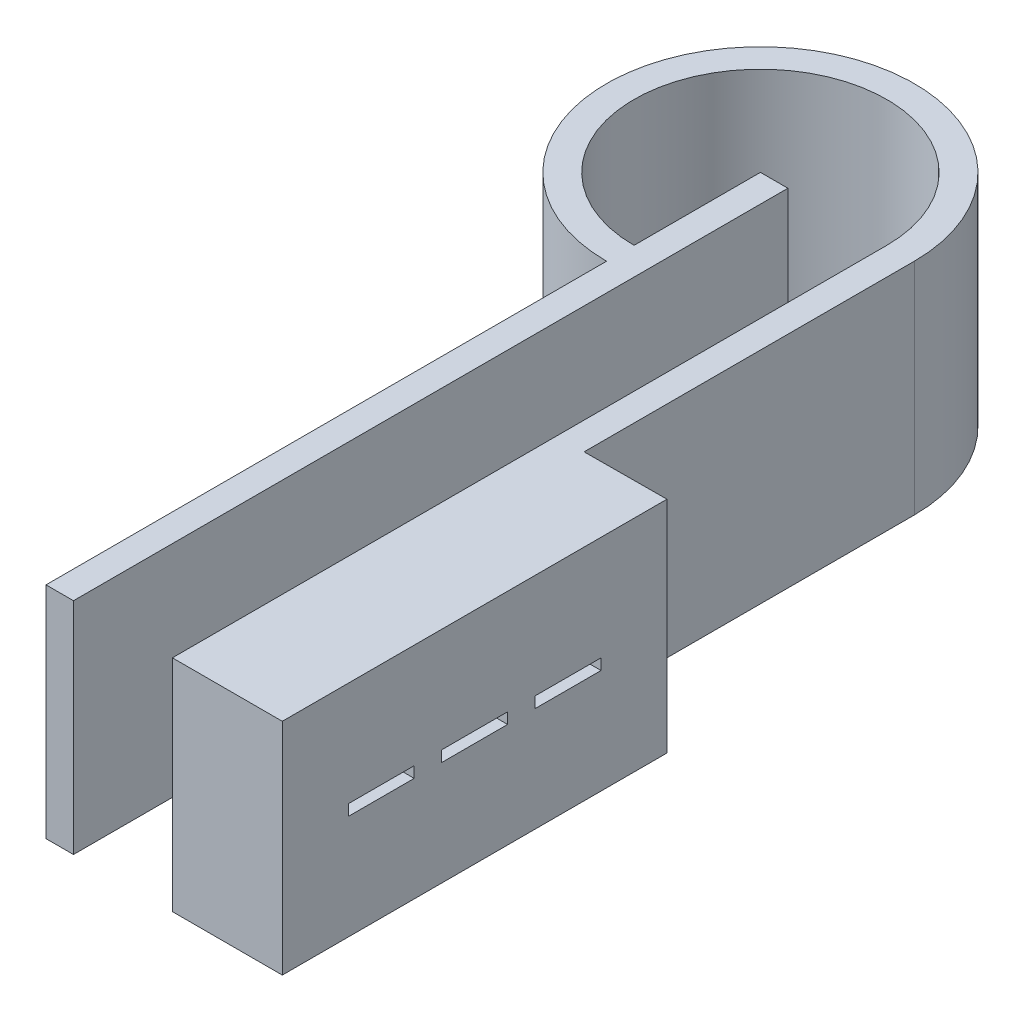
ISO-10303-21;
HEADER;
FILE_DESCRIPTION(('STEP AP214'),'2;1');
FILE_NAME('part.step','',(''),(''),'','','');
FILE_SCHEMA(('AUTOMOTIVE_DESIGN { 1 0 10303 214 1 1 1 1 }'));
ENDSEC;
DATA;
#1=APPLICATION_CONTEXT('core data for automotive mechanical design processes');
#2=APPLICATION_PROTOCOL_DEFINITION('international standard','automotive_design',2000,#1);
#3=PRODUCT_CONTEXT('',#1,'mechanical');
#4=PRODUCT('Part','Part','',(#3));
#5=PRODUCT_RELATED_PRODUCT_CATEGORY('part','',(#4));
#6=PRODUCT_DEFINITION_FORMATION('','',#4);
#7=PRODUCT_DEFINITION_CONTEXT('part definition',#1,'design');
#8=PRODUCT_DEFINITION('design','',#6,#7);
#9=PRODUCT_DEFINITION_SHAPE('','',#8);
#10=(LENGTH_UNIT() NAMED_UNIT(*) SI_UNIT(.MILLI.,.METRE.));
#11=(NAMED_UNIT(*) PLANE_ANGLE_UNIT() SI_UNIT($,.RADIAN.));
#12=(NAMED_UNIT(*) SI_UNIT($,.STERADIAN.) SOLID_ANGLE_UNIT());
#13=UNCERTAINTY_MEASURE_WITH_UNIT(LENGTH_MEASURE(1.E-05),#10,'distance_accuracy_value','');
#14=(GEOMETRIC_REPRESENTATION_CONTEXT(3) GLOBAL_UNCERTAINTY_ASSIGNED_CONTEXT((#13)) GLOBAL_UNIT_ASSIGNED_CONTEXT((#10,
#11,#12)) REPRESENTATION_CONTEXT('',''));
#15=CARTESIAN_POINT('',(0.,0.,0.));
#16=DIRECTION('',(0.,0.,1.));
#17=DIRECTION('',(1.,0.,0.));
#18=AXIS2_PLACEMENT_3D('',#15,#16,#17);
#19=CARTESIAN_POINT('',(-22.301242738674,20.,0.));
#20=DIRECTION('',(1.,0.,0.));
#21=DIRECTION('',(0.,0.,-1.));
#22=AXIS2_PLACEMENT_3D('',#19,#20,#21);
#23=PLANE('',#22);
#24=DIRECTION('',(0.,0.,1.));
#25=VECTOR('',#24,1.);
#26=CARTESIAN_POINT('',(-22.301242738674,0.,0.));
#27=LINE('',#26,#25);
#28=CARTESIAN_POINT('',(-22.301242738674,0.,7.2511032795588));
#29=VERTEX_POINT('',#28);
#30=CARTESIAN_POINT('',(-22.301242738674,0.,42.2511032795588));
#31=VERTEX_POINT('',#30);
#32=EDGE_CURVE('E427',#29,#31,#27,.T.);
#33=ORIENTED_EDGE('',*,*,#32,.F.);
#34=DIRECTION('',(0.,-1.,0.));
#35=VECTOR('',#34,1.);
#36=CARTESIAN_POINT('',(-22.301242738674,20.,7.2511032795588));
#37=LINE('',#36,#35);
#38=CARTESIAN_POINT('',(-22.301242738674,20.,7.2511032795588));
#39=VERTEX_POINT('',#38);
#40=EDGE_CURVE('E452',#39,#29,#37,.T.);
#41=ORIENTED_EDGE('',*,*,#40,.F.);
#42=DIRECTION('',(0.,0.,1.));
#43=VECTOR('',#42,1.);
#44=CARTESIAN_POINT('',(-22.301242738674,20.,0.));
#45=LINE('',#44,#43);
#46=CARTESIAN_POINT('',(-22.301242738674,20.,42.2511032795588));
#47=VERTEX_POINT('',#46);
#48=EDGE_CURVE('E257',#39,#47,#45,.T.);
#49=ORIENTED_EDGE('',*,*,#48,.T.);
#50=DIRECTION('',(0.,1.,0.));
#51=VECTOR('',#50,1.);
#52=CARTESIAN_POINT('',(-22.301242738674,0.,42.2511032795588));
#53=LINE('',#52,#51);
#54=EDGE_CURVE('E266',#31,#47,#53,.T.);
#55=ORIENTED_EDGE('',*,*,#54,.F.);
#56=EDGE_LOOP('',(#33,#41,#49,#55));
#57=FACE_BOUND('',#56,.T.);
#58=DIRECTION('',(0.,0.,1.));
#59=VECTOR('',#58,1.);
#60=CARTESIAN_POINT('',(-22.301242738674,10.5,0.));
#61=LINE('',#60,#59);
#62=CARTESIAN_POINT('',(-22.301242738674,10.5,21.7511032795588));
#63=VERTEX_POINT('',#62);
#64=CARTESIAN_POINT('',(-22.301242738674,10.5,27.7511032795588));
#65=VERTEX_POINT('',#64);
#66=EDGE_CURVE('E352',#63,#65,#61,.T.);
#67=ORIENTED_EDGE('',*,*,#66,.F.);
#68=DIRECTION('',(0.,-1.,0.));
#69=VECTOR('',#68,1.);
#70=CARTESIAN_POINT('',(-22.301242738674,0.,21.7511032795588));
#71=LINE('',#70,#69);
#72=CARTESIAN_POINT('',(-22.301242738674,9.5,21.7511032795588));
#73=VERTEX_POINT('',#72);
#74=EDGE_CURVE('E315',#63,#73,#71,.T.);
#75=ORIENTED_EDGE('',*,*,#74,.T.);
#76=DIRECTION('',(0.,0.,1.));
#77=VECTOR('',#76,1.);
#78=CARTESIAN_POINT('',(-22.301242738674,9.5,0.));
#79=LINE('',#78,#77);
#80=CARTESIAN_POINT('',(-22.301242738674,9.5,27.7511032795588));
#81=VERTEX_POINT('',#80);
#82=EDGE_CURVE('E360',#73,#81,#79,.T.);
#83=ORIENTED_EDGE('',*,*,#82,.T.);
#84=DIRECTION('',(0.,-1.,0.));
#85=VECTOR('',#84,1.);
#86=CARTESIAN_POINT('',(-22.301242738674,0.,27.7511032795588));
#87=LINE('',#86,#85);
#88=EDGE_CURVE('E356',#65,#81,#87,.T.);
#89=ORIENTED_EDGE('',*,*,#88,.F.);
#90=EDGE_LOOP('',(#67,#75,#83,#89));
#91=FACE_BOUND('',#90,.T.);
#92=DIRECTION('',(0.,-1.,0.));
#93=VECTOR('',#92,1.);
#94=CARTESIAN_POINT('',(-22.301242738674,0.,13.2511032795588));
#95=LINE('',#94,#93);
#96=CARTESIAN_POINT('',(-22.301242738674,10.5,13.2511032795588));
#97=VERTEX_POINT('',#96);
#98=CARTESIAN_POINT('',(-22.301242738674,9.50000000000001,13.2511032795588));
#99=VERTEX_POINT('',#98);
#100=EDGE_CURVE('E298',#97,#99,#95,.T.);
#101=ORIENTED_EDGE('',*,*,#100,.T.);
#102=DIRECTION('',(0.,0.,1.));
#103=VECTOR('',#102,1.);
#104=CARTESIAN_POINT('',(-22.301242738674,9.5,0.));
#105=LINE('',#104,#103);
#106=CARTESIAN_POINT('',(-22.301242738674,9.5,19.2511032795588));
#107=VERTEX_POINT('',#106);
#108=EDGE_CURVE('E105',#99,#107,#105,.T.);
#109=ORIENTED_EDGE('',*,*,#108,.T.);
#110=DIRECTION('',(0.,-1.,0.));
#111=VECTOR('',#110,1.);
#112=CARTESIAN_POINT('',(-22.301242738674,0.,19.2511032795588));
#113=LINE('',#112,#111);
#114=CARTESIAN_POINT('',(-22.301242738674,10.5,19.2511032795588));
#115=VERTEX_POINT('',#114);
#116=EDGE_CURVE('E307',#115,#107,#113,.T.);
#117=ORIENTED_EDGE('',*,*,#116,.F.);
#118=DIRECTION('',(0.,0.,1.));
#119=VECTOR('',#118,1.);
#120=CARTESIAN_POINT('',(-22.301242738674,10.5,0.));
#121=LINE('',#120,#119);
#122=EDGE_CURVE('E303',#97,#115,#121,.T.);
#123=ORIENTED_EDGE('',*,*,#122,.F.);
#124=EDGE_LOOP('',(#101,#109,#117,#123));
#125=FACE_BOUND('',#124,.T.);
#126=DIRECTION('',(0.,0.,1.));
#127=VECTOR('',#126,1.);
#128=CARTESIAN_POINT('',(-22.301242738674,10.5,0.));
#129=LINE('',#128,#127);
#130=CARTESIAN_POINT('',(-22.301242738674,10.5,30.2511032795588));
#131=VERTEX_POINT('',#130);
#132=CARTESIAN_POINT('',(-22.301242738674,10.5,36.2511032795588));
#133=VERTEX_POINT('',#132);
#134=EDGE_CURVE('E326',#131,#133,#129,.T.);
#135=ORIENTED_EDGE('',*,*,#134,.F.);
#136=DIRECTION('',(0.,-1.,0.));
#137=VECTOR('',#136,1.);
#138=CARTESIAN_POINT('',(-22.301242738674,0.,30.2511032795588));
#139=LINE('',#138,#137);
#140=CARTESIAN_POINT('',(-22.301242738674,9.5,30.2511032795588));
#141=VERTEX_POINT('',#140);
#142=EDGE_CURVE('E97',#131,#141,#139,.T.);
#143=ORIENTED_EDGE('',*,*,#142,.T.);
#144=DIRECTION('',(0.,0.,1.));
#145=VECTOR('',#144,1.);
#146=CARTESIAN_POINT('',(-22.301242738674,9.5,0.));
#147=LINE('',#146,#145);
#148=CARTESIAN_POINT('',(-22.301242738674,9.5,36.2511032795588));
#149=VERTEX_POINT('',#148);
#150=EDGE_CURVE('E334',#141,#149,#147,.T.);
#151=ORIENTED_EDGE('',*,*,#150,.T.);
#152=DIRECTION('',(0.,-1.,0.));
#153=VECTOR('',#152,1.);
#154=CARTESIAN_POINT('',(-22.301242738674,0.,36.2511032795588));
#155=LINE('',#154,#153);
#156=EDGE_CURVE('E330',#133,#149,#155,.T.);
#157=ORIENTED_EDGE('',*,*,#156,.F.);
#158=EDGE_LOOP('',(#135,#143,#151,#157));
#159=FACE_BOUND('',#158,.T.);
#160=ADVANCED_FACE('F81',(#57,#91,#125,#159),#23,.T.);
#161=CARTESIAN_POINT('',(-24.301242738674,10.,24.7511032795588));
#162=DIRECTION('',(-1.,0.,0.));
#163=DIRECTION('',(0.,0.,1.));
#164=AXIS2_PLACEMENT_3D('',#161,#162,#163);
#165=PLANE('',#164);
#166=CARTESIAN_POINT('',(-24.301242738674,10.,24.7511032795588));
#167=DIRECTION('',(-1.,0.,0.));
#168=DIRECTION('',(0.,0.,1.));
#169=AXIS2_PLACEMENT_3D('',#166,#167,#168);
#170=CIRCLE('',#169,4.);
#171=CARTESIAN_POINT('',(-24.301242738674,10.,28.7511032795588));
#172=VERTEX_POINT('',#171);
#173=EDGE_CURVE('E368',#172,#172,#170,.T.);
#174=ORIENTED_EDGE('',*,*,#173,.T.);
#175=EDGE_LOOP('',(#174));
#176=FACE_BOUND('',#175,.T.);
#177=DIRECTION('',(0.,0.,-1.));
#178=VECTOR('',#177,1.);
#179=CARTESIAN_POINT('',(-24.301242738674,9.5,24.7511032795588));
#180=LINE('',#179,#178);
#181=CARTESIAN_POINT('',(-24.301242738674,9.5,27.7511032795588));
#182=VERTEX_POINT('',#181);
#183=CARTESIAN_POINT('',(-24.301242738674,9.5,21.7511032795588));
#184=VERTEX_POINT('',#183);
#185=EDGE_CURVE('E90',#182,#184,#180,.T.);
#186=ORIENTED_EDGE('',*,*,#185,.T.);
#187=DIRECTION('',(0.,1.,0.));
#188=VECTOR('',#187,1.);
#189=CARTESIAN_POINT('',(-24.301242738674,9.99999999999999,21.7511032795588));
#190=LINE('',#189,#188);
#191=CARTESIAN_POINT('',(-24.301242738674,10.5,21.7511032795588));
#192=VERTEX_POINT('',#191);
#193=EDGE_CURVE('E12',#184,#192,#190,.T.);
#194=ORIENTED_EDGE('',*,*,#193,.T.);
#195=DIRECTION('',(0.,0.,-1.));
#196=VECTOR('',#195,1.);
#197=CARTESIAN_POINT('',(-24.301242738674,10.5,24.7511032795588));
#198=LINE('',#197,#196);
#199=CARTESIAN_POINT('',(-24.301242738674,10.5,27.7511032795588));
#200=VERTEX_POINT('',#199);
#201=EDGE_CURVE('E515',#200,#192,#198,.T.);
#202=ORIENTED_EDGE('',*,*,#201,.F.);
#203=DIRECTION('',(0.,1.,0.));
#204=VECTOR('',#203,1.);
#205=CARTESIAN_POINT('',(-24.301242738674,10.,27.7511032795588));
#206=LINE('',#205,#204);
#207=EDGE_CURVE('E518',#182,#200,#206,.T.);
#208=ORIENTED_EDGE('',*,*,#207,.F.);
#209=EDGE_LOOP('',(#186,#194,#202,#208));
#210=FACE_BOUND('',#209,.T.);
#211=ADVANCED_FACE('F525',(#176,#210),#165,.T.);
#212=CARTESIAN_POINT('',(-24.301242738674,10.,33.2011032795588));
#213=DIRECTION('',(-1.,0.,0.));
#214=DIRECTION('',(0.,0.,1.));
#215=AXIS2_PLACEMENT_3D('',#212,#213,#214);
#216=PLANE('',#215);
#217=CARTESIAN_POINT('',(-24.301242738674,10.,33.2011032795588));
#218=DIRECTION('',(-1.,0.,0.));
#219=DIRECTION('',(0.,0.,1.));
#220=AXIS2_PLACEMENT_3D('',#217,#218,#219);
#221=CIRCLE('',#220,4.);
#222=CARTESIAN_POINT('',(-24.301242738674,10.,37.2011032795588));
#223=VERTEX_POINT('',#222);
#224=EDGE_CURVE('E391',#223,#223,#221,.T.);
#225=ORIENTED_EDGE('',*,*,#224,.T.);
#226=EDGE_LOOP('',(#225));
#227=FACE_BOUND('',#226,.T.);
#228=DIRECTION('',(0.,0.,-1.));
#229=VECTOR('',#228,1.);
#230=CARTESIAN_POINT('',(-24.301242738674,9.5,33.2011032795588));
#231=LINE('',#230,#229);
#232=CARTESIAN_POINT('',(-24.301242738674,9.5,36.2511032795588));
#233=VERTEX_POINT('',#232);
#234=CARTESIAN_POINT('',(-24.301242738674,9.5,30.2511032795588));
#235=VERTEX_POINT('',#234);
#236=EDGE_CURVE('E507',#233,#235,#231,.T.);
#237=ORIENTED_EDGE('',*,*,#236,.T.);
#238=DIRECTION('',(0.,1.,0.));
#239=VECTOR('',#238,1.);
#240=CARTESIAN_POINT('',(-24.301242738674,10.,30.2511032795588));
#241=LINE('',#240,#239);
#242=CARTESIAN_POINT('',(-24.301242738674,10.5,30.2511032795588));
#243=VERTEX_POINT('',#242);
#244=EDGE_CURVE('E511',#235,#243,#241,.T.);
#245=ORIENTED_EDGE('',*,*,#244,.T.);
#246=DIRECTION('',(0.,0.,-1.));
#247=VECTOR('',#246,1.);
#248=CARTESIAN_POINT('',(-24.301242738674,10.5,33.2011032795588));
#249=LINE('',#248,#247);
#250=CARTESIAN_POINT('',(-24.301242738674,10.5,36.2511032795588));
#251=VERTEX_POINT('',#250);
#252=EDGE_CURVE('E500',#251,#243,#249,.T.);
#253=ORIENTED_EDGE('',*,*,#252,.F.);
#254=DIRECTION('',(0.,1.,0.));
#255=VECTOR('',#254,1.);
#256=CARTESIAN_POINT('',(-24.301242738674,10.,36.2511032795588));
#257=LINE('',#256,#255);
#258=EDGE_CURVE('E503',#233,#251,#257,.T.);
#259=ORIENTED_EDGE('',*,*,#258,.F.);
#260=EDGE_LOOP('',(#237,#245,#253,#259));
#261=FACE_BOUND('',#260,.T.);
#262=ADVANCED_FACE('F560',(#227,#261),#216,.T.);
#263=CARTESIAN_POINT('',(-24.301242738674,0.,0.));
#264=DIRECTION('',(-1.,0.,0.));
#265=DIRECTION('',(0.,0.,1.));
#266=AXIS2_PLACEMENT_3D('',#263,#264,#265);
#267=PLANE('',#266);
#268=CARTESIAN_POINT('',(-24.301242738674,10.,16.2511032795588));
#269=DIRECTION('',(-1.,0.,0.));
#270=DIRECTION('',(0.,0.,1.));
#271=AXIS2_PLACEMENT_3D('',#268,#269,#270);
#272=CIRCLE('',#271,4.);
#273=CARTESIAN_POINT('',(-24.301242738674,10.,20.2511032795588));
#274=VERTEX_POINT('',#273);
#275=EDGE_CURVE('E378',#274,#274,#272,.T.);
#276=ORIENTED_EDGE('',*,*,#275,.T.);
#277=EDGE_LOOP('',(#276));
#278=FACE_BOUND('',#277,.T.);
#279=DIRECTION('',(0.,1.,0.));
#280=VECTOR('',#279,1.);
#281=CARTESIAN_POINT('',(-24.301242738674,0.,19.2511032795588));
#282=LINE('',#281,#280);
#283=CARTESIAN_POINT('',(-24.301242738674,9.5,19.2511032795588));
#284=VERTEX_POINT('',#283);
#285=CARTESIAN_POINT('',(-24.301242738674,10.5,19.2511032795588));
#286=VERTEX_POINT('',#285);
#287=EDGE_CURVE('E493',#284,#286,#282,.T.);
#288=ORIENTED_EDGE('',*,*,#287,.F.);
#289=DIRECTION('',(0.,0.,-1.));
#290=VECTOR('',#289,1.);
#291=CARTESIAN_POINT('',(-24.301242738674,9.5,0.));
#292=LINE('',#291,#290);
#293=CARTESIAN_POINT('',(-24.301242738674,9.50000000000001,13.2511032795588));
#294=VERTEX_POINT('',#293);
#295=EDGE_CURVE('E496',#284,#294,#292,.T.);
#296=ORIENTED_EDGE('',*,*,#295,.T.);
#297=DIRECTION('',(0.,1.,0.));
#298=VECTOR('',#297,1.);
#299=CARTESIAN_POINT('',(-24.301242738674,0.,13.2511032795588));
#300=LINE('',#299,#298);
#301=CARTESIAN_POINT('',(-24.301242738674,10.5,13.2511032795588));
#302=VERTEX_POINT('',#301);
#303=EDGE_CURVE('E458',#294,#302,#300,.T.);
#304=ORIENTED_EDGE('',*,*,#303,.T.);
#305=DIRECTION('',(0.,0.,-1.));
#306=VECTOR('',#305,1.);
#307=CARTESIAN_POINT('',(-24.301242738674,10.5,0.));
#308=LINE('',#307,#306);
#309=EDGE_CURVE('E489',#286,#302,#308,.T.);
#310=ORIENTED_EDGE('',*,*,#309,.F.);
#311=EDGE_LOOP('',(#288,#296,#304,#310));
#312=FACE_BOUND('',#311,.T.);
#313=ADVANCED_FACE('F570',(#278,#312),#267,.T.);
#314=CARTESIAN_POINT('',(-32.301242738674,20.,0.));
#315=DIRECTION('',(1.,0.,0.));
#316=DIRECTION('',(0.,0.,-1.));
#317=AXIS2_PLACEMENT_3D('',#314,#315,#316);
#318=PLANE('',#317);
#319=CARTESIAN_POINT('',(-32.301242738674,10.,16.2511032795588));
#320=DIRECTION('',(-1.,0.,0.));
#321=DIRECTION('',(0.,0.,1.));
#322=AXIS2_PLACEMENT_3D('',#319,#320,#321);
#323=CIRCLE('',#322,4.);
#324=CARTESIAN_POINT('',(-32.301242738674,10.,20.2511032795588));
#325=VERTEX_POINT('',#324);
#326=EDGE_CURVE('E383',#325,#325,#323,.T.);
#327=ORIENTED_EDGE('',*,*,#326,.F.);
#328=EDGE_LOOP('',(#327));
#329=FACE_BOUND('',#328,.T.);
#330=CARTESIAN_POINT('',(-32.301242738674,10.,33.2011032795588));
#331=DIRECTION('',(-1.,0.,0.));
#332=DIRECTION('',(0.,0.,1.));
#333=AXIS2_PLACEMENT_3D('',#330,#331,#332);
#334=CIRCLE('',#333,4.);
#335=CARTESIAN_POINT('',(-32.301242738674,10.,37.2011032795588));
#336=VERTEX_POINT('',#335);
#337=EDGE_CURVE('E387',#336,#336,#334,.T.);
#338=ORIENTED_EDGE('',*,*,#337,.F.);
#339=EDGE_LOOP('',(#338));
#340=FACE_BOUND('',#339,.T.);
#341=CARTESIAN_POINT('',(-32.301242738674,10.,24.7511032795588));
#342=DIRECTION('',(-1.,0.,0.));
#343=DIRECTION('',(0.,0.,1.));
#344=AXIS2_PLACEMENT_3D('',#341,#342,#343);
#345=CIRCLE('',#344,4.);
#346=CARTESIAN_POINT('',(-32.301242738674,10.,28.7511032795588));
#347=VERTEX_POINT('',#346);
#348=EDGE_CURVE('E395',#347,#347,#345,.T.);
#349=ORIENTED_EDGE('',*,*,#348,.F.);
#350=EDGE_LOOP('',(#349));
#351=FACE_BOUND('',#350,.T.);
#352=DIRECTION('',(0.,0.,1.));
#353=VECTOR('',#352,1.);
#354=CARTESIAN_POINT('',(-32.301242738674,0.,0.));
#355=LINE('',#354,#353);
#356=CARTESIAN_POINT('',(-32.301242738674,0.,-22.7488967204412));
#357=VERTEX_POINT('',#356);
#358=CARTESIAN_POINT('',(-32.301242738674,0.,42.2511032795588));
#359=VERTEX_POINT('',#358);
#360=EDGE_CURVE('E271',#357,#359,#355,.T.);
#361=ORIENTED_EDGE('',*,*,#360,.T.);
#362=DIRECTION('',(0.,-1.,0.));
#363=VECTOR('',#362,1.);
#364=CARTESIAN_POINT('',(-32.301242738674,0.,42.2511032795588));
#365=LINE('',#364,#363);
#366=CARTESIAN_POINT('',(-32.301242738674,20.,42.2511032795588));
#367=VERTEX_POINT('',#366);
#368=EDGE_CURVE('E264',#367,#359,#365,.T.);
#369=ORIENTED_EDGE('',*,*,#368,.F.);
#370=DIRECTION('',(0.,0.,1.));
#371=VECTOR('',#370,1.);
#372=CARTESIAN_POINT('',(-32.301242738674,20.,0.));
#373=LINE('',#372,#371);
#374=CARTESIAN_POINT('',(-32.301242738674,20.,-22.7488967204412));
#375=VERTEX_POINT('',#374);
#376=EDGE_CURVE('E246',#375,#367,#373,.T.);
#377=ORIENTED_EDGE('',*,*,#376,.F.);
#378=DIRECTION('',(0.,-1.,0.));
#379=VECTOR('',#378,1.);
#380=CARTESIAN_POINT('',(-32.301242738674,20.,-22.7488967204412));
#381=LINE('',#380,#379);
#382=EDGE_CURVE('E455',#375,#357,#381,.T.);
#383=ORIENTED_EDGE('',*,*,#382,.T.);
#384=EDGE_LOOP('',(#361,#369,#377,#383));
#385=FACE_BOUND('',#384,.T.);
#386=ADVANCED_FACE('F269',(#329,#340,#351,#385),#318,.F.);
#387=CARTESIAN_POINT('',(0.0399342819018193,20.,7.12590102684763));
#388=DIRECTION('',(-0.00560401480160071,0.,-0.999984297385766));
#389=DIRECTION('',(-0.999984297385766,0.,0.00560401480160071));
#390=AXIS2_PLACEMENT_3D('',#387,#388,#389);
#391=PLANE('',#390);
#392=DIRECTION('',(0.999984297385766,0.,-0.00560401480160071));
#393=VECTOR('',#392,1.);
#394=CARTESIAN_POINT('',(0.0399342819018193,0.,7.12590102684763));
#395=LINE('',#394,#393);
#396=CARTESIAN_POINT('',(-29.801242738674,0.,7.29313405056379));
#397=VERTEX_POINT('',#396);
#398=EDGE_CURVE('E430',#397,#29,#395,.T.);
#399=ORIENTED_EDGE('',*,*,#398,.F.);
#400=DIRECTION('',(0.,-1.,0.));
#401=VECTOR('',#400,1.);
#402=CARTESIAN_POINT('',(-29.801242738674,20.,7.29313405056379));
#403=LINE('',#402,#401);
#404=CARTESIAN_POINT('',(-29.801242738674,20.,7.29313405056379));
#405=VERTEX_POINT('',#404);
#406=EDGE_CURVE('E449',#405,#397,#403,.T.);
#407=ORIENTED_EDGE('',*,*,#406,.F.);
#408=DIRECTION('',(0.999984297385766,0.,-0.00560401480160071));
#409=VECTOR('',#408,1.);
#410=CARTESIAN_POINT('',(0.0399342819018193,20.,7.12590102684763));
#411=LINE('',#410,#409);
#412=EDGE_CURVE('E407',#405,#39,#411,.T.);
#413=ORIENTED_EDGE('',*,*,#412,.T.);
#414=ORIENTED_EDGE('',*,*,#40,.T.);
#415=EDGE_LOOP('',(#399,#407,#413,#414));
#416=FACE_BOUND('',#415,.T.);
#417=ADVANCED_FACE('F566',(#416),#391,.T.);
#418=CARTESIAN_POINT('',(-29.801242738674,20.,0.));
#419=DIRECTION('',(1.,0.,0.));
#420=DIRECTION('',(0.,0.,-1.));
#421=AXIS2_PLACEMENT_3D('',#418,#419,#420);
#422=PLANE('',#421);
#423=DIRECTION('',(0.,0.,1.));
#424=VECTOR('',#423,1.);
#425=CARTESIAN_POINT('',(-29.801242738674,0.,0.));
#426=LINE('',#425,#424);
#427=CARTESIAN_POINT('',(-29.801242738674,0.,-22.7488967204412));
#428=VERTEX_POINT('',#427);
#429=EDGE_CURVE('E434',#428,#397,#426,.T.);
#430=ORIENTED_EDGE('',*,*,#429,.F.);
#431=DIRECTION('',(0.,-1.,0.));
#432=VECTOR('',#431,1.);
#433=CARTESIAN_POINT('',(-29.801242738674,20.,-22.7488967204412));
#434=LINE('',#433,#432);
#435=CARTESIAN_POINT('',(-29.801242738674,20.,-22.7488967204412));
#436=VERTEX_POINT('',#435);
#437=EDGE_CURVE('E446',#436,#428,#434,.T.);
#438=ORIENTED_EDGE('',*,*,#437,.F.);
#439=DIRECTION('',(0.,0.,1.));
#440=VECTOR('',#439,1.);
#441=CARTESIAN_POINT('',(-29.801242738674,20.,0.));
#442=LINE('',#441,#440);
#443=EDGE_CURVE('E411',#436,#405,#442,.T.);
#444=ORIENTED_EDGE('',*,*,#443,.T.);
#445=ORIENTED_EDGE('',*,*,#406,.T.);
#446=EDGE_LOOP('',(#430,#438,#444,#445));
#447=FACE_BOUND('',#446,.T.);
#448=ADVANCED_FACE('F613',(#447),#422,.T.);
#449=CARTESIAN_POINT('',(-43.801242738674,20.,-22.7488967204412));
#450=DIRECTION('',(0.,-1.,0.));
#451=DIRECTION('',(0.,0.,-1.));
#452=AXIS2_PLACEMENT_3D('',#449,#450,#451);
#453=CYLINDRICAL_SURFACE('',#452,14.);
#454=CARTESIAN_POINT('',(-43.801242738674,0.,-22.7488967204412));
#455=DIRECTION('',(0.,1.,0.));
#456=DIRECTION('',(0.,0.,1.));
#457=AXIS2_PLACEMENT_3D('',#454,#455,#456);
#458=CIRCLE('',#457,14.);
#459=CARTESIAN_POINT('',(-43.801242738674,0.,-8.74889672044118));
#460=VERTEX_POINT('',#459);
#461=EDGE_CURVE('E403',#428,#460,#458,.T.);
#462=ORIENTED_EDGE('',*,*,#461,.T.);
#463=DIRECTION('',(0.,-1.,0.));
#464=VECTOR('',#463,1.);
#465=CARTESIAN_POINT('',(-43.801242738674,20.,-8.74889672044118));
#466=LINE('',#465,#464);
#467=CARTESIAN_POINT('',(-43.801242738674,20.,-8.74889672044118));
#468=VERTEX_POINT('',#467);
#469=EDGE_CURVE('E443',#468,#460,#466,.T.);
#470=ORIENTED_EDGE('',*,*,#469,.F.);
#471=CARTESIAN_POINT('',(-43.801242738674,20.,-22.7488967204412));
#472=DIRECTION('',(0.,1.,0.));
#473=DIRECTION('',(0.,0.,1.));
#474=AXIS2_PLACEMENT_3D('',#471,#472,#473);
#475=CIRCLE('',#474,14.);
#476=EDGE_CURVE('E415',#436,#468,#475,.T.);
#477=ORIENTED_EDGE('',*,*,#476,.F.);
#478=ORIENTED_EDGE('',*,*,#437,.T.);
#479=EDGE_LOOP('',(#462,#470,#477,#478));
#480=FACE_BOUND('',#479,.T.);
#481=ADVANCED_FACE('F576',(#480),#453,.T.);
#482=CARTESIAN_POINT('',(-43.801242738674,20.,-22.7488967204412));
#483=DIRECTION('',(0.,-1.,0.));
#484=DIRECTION('',(0.,0.,-1.));
#485=AXIS2_PLACEMENT_3D('',#482,#483,#484);
#486=CYLINDRICAL_SURFACE('',#485,11.5);
#487=CARTESIAN_POINT('',(-43.801242738674,0.,-22.7488967204412));
#488=DIRECTION('',(0.,1.,0.));
#489=DIRECTION('',(0.,0.,1.));
#490=AXIS2_PLACEMENT_3D('',#487,#488,#489);
#491=CIRCLE('',#490,11.5);
#492=CARTESIAN_POINT('',(-43.801242738674,0.,-11.2488967204412));
#493=VERTEX_POINT('',#492);
#494=EDGE_CURVE('E420',#357,#493,#491,.T.);
#495=ORIENTED_EDGE('',*,*,#494,.F.);
#496=ORIENTED_EDGE('',*,*,#382,.F.);
#497=CARTESIAN_POINT('',(-43.801242738674,20.,-22.7488967204412));
#498=DIRECTION('',(0.,1.,0.));
#499=DIRECTION('',(0.,0.,1.));
#500=AXIS2_PLACEMENT_3D('',#497,#498,#499);
#501=CIRCLE('',#500,11.5);
#502=CARTESIAN_POINT('',(-43.801242738674,20.,-11.2488967204412));
#503=VERTEX_POINT('',#502);
#504=EDGE_CURVE('E253',#375,#503,#501,.T.);
#505=ORIENTED_EDGE('',*,*,#504,.T.);
#506=DIRECTION('',(0.,-1.,0.));
#507=VECTOR('',#506,1.);
#508=CARTESIAN_POINT('',(-43.801242738674,20.,-11.2488967204412));
#509=LINE('',#508,#507);
#510=EDGE_CURVE('E419',#503,#493,#509,.T.);
#511=ORIENTED_EDGE('',*,*,#510,.T.);
#512=EDGE_LOOP('',(#495,#496,#505,#511));
#513=FACE_BOUND('',#512,.T.);
#514=ADVANCED_FACE('F572',(#513),#486,.F.);
#515=CARTESIAN_POINT('',(0.,0.,0.));
#516=DIRECTION('',(0.,1.,0.));
#517=DIRECTION('',(0.,0.,1.));
#518=AXIS2_PLACEMENT_3D('',#515,#516,#517);
#519=PLANE('',#518);
#520=ORIENTED_EDGE('',*,*,#494,.T.);
#521=DIRECTION('',(0.,0.,1.));
#522=VECTOR('',#521,1.);
#523=CARTESIAN_POINT('',(-43.801242738674,0.,-22.7488967204412));
#524=LINE('',#523,#522);
#525=CARTESIAN_POINT('',(-43.801242738674,0.,-22.7488967204412));
#526=VERTEX_POINT('',#525);
#527=EDGE_CURVE('E464',#526,#493,#524,.T.);
#528=ORIENTED_EDGE('',*,*,#527,.F.);
#529=DIRECTION('',(1.,0.,0.));
#530=VECTOR('',#529,1.);
#531=CARTESIAN_POINT('',(-43.801242738674,0.,-22.7488967204412));
#532=LINE('',#531,#530);
#533=CARTESIAN_POINT('',(-41.301242738674,0.,-22.7488967204412));
#534=VERTEX_POINT('',#533);
#535=EDGE_CURVE('E382',#526,#534,#532,.T.);
#536=ORIENTED_EDGE('',*,*,#535,.T.);
#537=DIRECTION('',(0.,0.,1.));
#538=VECTOR('',#537,1.);
#539=CARTESIAN_POINT('',(-41.301242738674,0.,-22.7488967204412));
#540=LINE('',#539,#538);
#541=CARTESIAN_POINT('',(-41.301242738674,0.,42.2511032795588));
#542=VERTEX_POINT('',#541);
#543=EDGE_CURVE('E475',#534,#542,#540,.T.);
#544=ORIENTED_EDGE('',*,*,#543,.T.);
#545=DIRECTION('',(1.,0.,0.));
#546=VECTOR('',#545,1.);
#547=CARTESIAN_POINT('',(-43.801242738674,0.,42.2511032795588));
#548=LINE('',#547,#546);
#549=CARTESIAN_POINT('',(-43.801242738674,0.,42.2511032795588));
#550=VERTEX_POINT('',#549);
#551=EDGE_CURVE('E280',#550,#542,#548,.T.);
#552=ORIENTED_EDGE('',*,*,#551,.F.);
#553=EDGE_CURVE('E478',#460,#550,#524,.T.);
#554=ORIENTED_EDGE('',*,*,#553,.F.);
#555=ORIENTED_EDGE('',*,*,#461,.F.);
#556=ORIENTED_EDGE('',*,*,#429,.T.);
#557=ORIENTED_EDGE('',*,*,#398,.T.);
#558=ORIENTED_EDGE('',*,*,#32,.T.);
#559=DIRECTION('',(1.,0.,0.));
#560=VECTOR('',#559,1.);
#561=CARTESIAN_POINT('',(-32.301242738674,0.,42.2511032795588));
#562=LINE('',#561,#560);
#563=EDGE_CURVE('E275',#359,#31,#562,.T.);
#564=ORIENTED_EDGE('',*,*,#563,.F.);
#565=ORIENTED_EDGE('',*,*,#360,.F.);
#566=EDGE_LOOP('',(#520,#528,#536,#544,#552,#554,#555,#556,#557,#558,#564,#565));
#567=FACE_BOUND('',#566,.T.);
#568=ADVANCED_FACE('F575',(#567),#519,.F.);
#569=CARTESIAN_POINT('',(0.,20.,0.));
#570=DIRECTION('',(0.,1.,0.));
#571=DIRECTION('',(0.,0.,1.));
#572=AXIS2_PLACEMENT_3D('',#569,#570,#571);
#573=PLANE('',#572);
#574=ORIENTED_EDGE('',*,*,#504,.F.);
#575=ORIENTED_EDGE('',*,*,#376,.T.);
#576=DIRECTION('',(-1.,0.,0.));
#577=VECTOR('',#576,1.);
#578=CARTESIAN_POINT('',(-32.301242738674,20.,42.2511032795588));
#579=LINE('',#578,#577);
#580=EDGE_CURVE('E250',#47,#367,#579,.T.);
#581=ORIENTED_EDGE('',*,*,#580,.F.);
#582=ORIENTED_EDGE('',*,*,#48,.F.);
#583=ORIENTED_EDGE('',*,*,#412,.F.);
#584=ORIENTED_EDGE('',*,*,#443,.F.);
#585=ORIENTED_EDGE('',*,*,#476,.T.);
#586=DIRECTION('',(0.,0.,1.));
#587=VECTOR('',#586,1.);
#588=CARTESIAN_POINT('',(-43.801242738674,20.,-22.7488967204412));
#589=LINE('',#588,#587);
#590=CARTESIAN_POINT('',(-43.801242738674,20.,42.2511032795588));
#591=VERTEX_POINT('',#590);
#592=EDGE_CURVE('E467',#468,#591,#589,.T.);
#593=ORIENTED_EDGE('',*,*,#592,.T.);
#594=DIRECTION('',(-1.,0.,0.));
#595=VECTOR('',#594,1.);
#596=CARTESIAN_POINT('',(-43.801242738674,20.,42.2511032795588));
#597=LINE('',#596,#595);
#598=CARTESIAN_POINT('',(-41.301242738674,20.,42.2511032795588));
#599=VERTEX_POINT('',#598);
#600=EDGE_CURVE('E292',#599,#591,#597,.T.);
#601=ORIENTED_EDGE('',*,*,#600,.F.);
#602=DIRECTION('',(0.,0.,1.));
#603=VECTOR('',#602,1.);
#604=CARTESIAN_POINT('',(-41.301242738674,20.,-22.7488967204412));
#605=LINE('',#604,#603);
#606=CARTESIAN_POINT('',(-41.301242738674,20.,-22.7488967204412));
#607=VERTEX_POINT('',#606);
#608=EDGE_CURVE('E463',#607,#599,#605,.T.);
#609=ORIENTED_EDGE('',*,*,#608,.F.);
#610=DIRECTION('',(1.,0.,0.));
#611=VECTOR('',#610,1.);
#612=CARTESIAN_POINT('',(-43.801242738674,20.,-22.7488967204412));
#613=LINE('',#612,#611);
#614=CARTESIAN_POINT('',(-43.801242738674,20.,-22.7488967204412));
#615=VERTEX_POINT('',#614);
#616=EDGE_CURVE('E459',#615,#607,#613,.T.);
#617=ORIENTED_EDGE('',*,*,#616,.F.);
#618=EDGE_CURVE('E468',#615,#503,#589,.T.);
#619=ORIENTED_EDGE('',*,*,#618,.T.);
#620=EDGE_LOOP('',(#574,#575,#581,#582,#583,#584,#585,#593,#601,#609,#617,#619));
#621=FACE_BOUND('',#620,.T.);
#622=ADVANCED_FACE('F248',(#621),#573,.T.);
#623=CARTESIAN_POINT('',(-43.801242738674,20.,-22.7488967204412));
#624=DIRECTION('',(1.,0.,0.));
#625=DIRECTION('',(0.,0.,-1.));
#626=AXIS2_PLACEMENT_3D('',#623,#624,#625);
#627=PLANE('',#626);
#628=ORIENTED_EDGE('',*,*,#510,.F.);
#629=ORIENTED_EDGE('',*,*,#618,.F.);
#630=DIRECTION('',(0.,-1.,0.));
#631=VECTOR('',#630,1.);
#632=CARTESIAN_POINT('',(-43.801242738674,20.,-22.7488967204412));
#633=LINE('',#632,#631);
#634=EDGE_CURVE('E424',#615,#526,#633,.T.);
#635=ORIENTED_EDGE('',*,*,#634,.T.);
#636=ORIENTED_EDGE('',*,*,#527,.T.);
#637=EDGE_LOOP('',(#628,#629,#635,#636));
#638=FACE_BOUND('',#637,.T.);
#639=ADVANCED_FACE('F578',(#638),#627,.F.);
#640=ORIENTED_EDGE('',*,*,#592,.F.);
#641=ORIENTED_EDGE('',*,*,#469,.T.);
#642=ORIENTED_EDGE('',*,*,#553,.T.);
#643=DIRECTION('',(0.,-1.,0.));
#644=VECTOR('',#643,1.);
#645=CARTESIAN_POINT('',(-43.801242738674,20.,42.2511032795588));
#646=LINE('',#645,#644);
#647=EDGE_CURVE('E274',#591,#550,#646,.T.);
#648=ORIENTED_EDGE('',*,*,#647,.F.);
#649=EDGE_LOOP('',(#640,#641,#642,#648));
#650=FACE_BOUND('',#649,.T.);
#651=ADVANCED_FACE('F580',(#650),#627,.F.);
#652=CARTESIAN_POINT('',(-41.301242738674,20.,-22.7488967204412));
#653=DIRECTION('',(1.,0.,0.));
#654=DIRECTION('',(0.,0.,-1.));
#655=AXIS2_PLACEMENT_3D('',#652,#653,#654);
#656=PLANE('',#655);
#657=ORIENTED_EDGE('',*,*,#543,.F.);
#658=DIRECTION('',(0.,-1.,0.));
#659=VECTOR('',#658,1.);
#660=CARTESIAN_POINT('',(-41.301242738674,20.,-22.7488967204412));
#661=LINE('',#660,#659);
#662=EDGE_CURVE('E471',#607,#534,#661,.T.);
#663=ORIENTED_EDGE('',*,*,#662,.F.);
#664=ORIENTED_EDGE('',*,*,#608,.T.);
#665=DIRECTION('',(0.,1.,0.));
#666=VECTOR('',#665,1.);
#667=CARTESIAN_POINT('',(-41.301242738674,20.,42.2511032795588));
#668=LINE('',#667,#666);
#669=EDGE_CURVE('E288',#542,#599,#668,.T.);
#670=ORIENTED_EDGE('',*,*,#669,.F.);
#671=EDGE_LOOP('',(#657,#663,#664,#670));
#672=FACE_BOUND('',#671,.T.);
#673=ADVANCED_FACE('F582',(#672),#656,.T.);
#674=CARTESIAN_POINT('',(-43.801242738674,20.,-22.7488967204412));
#675=DIRECTION('',(0.,0.,-1.));
#676=DIRECTION('',(-1.,0.,0.));
#677=AXIS2_PLACEMENT_3D('',#674,#675,#676);
#678=PLANE('',#677);
#679=ORIENTED_EDGE('',*,*,#535,.F.);
#680=ORIENTED_EDGE('',*,*,#634,.F.);
#681=ORIENTED_EDGE('',*,*,#616,.T.);
#682=ORIENTED_EDGE('',*,*,#662,.T.);
#683=EDGE_LOOP('',(#679,#680,#681,#682));
#684=FACE_BOUND('',#683,.T.);
#685=ADVANCED_FACE('F83',(#684),#678,.T.);
#686=CARTESIAN_POINT('',(-24.301242738674,10.,24.7511032795588));
#687=DIRECTION('',(-1.,0.,0.));
#688=DIRECTION('',(0.,0.,1.));
#689=AXIS2_PLACEMENT_3D('',#686,#687,#688);
#690=CYLINDRICAL_SURFACE('',#689,4.);
#691=ORIENTED_EDGE('',*,*,#173,.F.);
#692=EDGE_LOOP('',(#691));
#693=FACE_BOUND('',#692,.T.);
#694=ORIENTED_EDGE('',*,*,#348,.T.);
#695=EDGE_LOOP('',(#694));
#696=FACE_BOUND('',#695,.T.);
#697=ADVANCED_FACE('F585',(#693,#696),#690,.F.);
#698=CARTESIAN_POINT('',(-24.301242738674,10.,33.2011032795588));
#699=DIRECTION('',(-1.,0.,0.));
#700=DIRECTION('',(0.,0.,1.));
#701=AXIS2_PLACEMENT_3D('',#698,#699,#700);
#702=CYLINDRICAL_SURFACE('',#701,4.);
#703=ORIENTED_EDGE('',*,*,#224,.F.);
#704=EDGE_LOOP('',(#703));
#705=FACE_BOUND('',#704,.T.);
#706=ORIENTED_EDGE('',*,*,#337,.T.);
#707=EDGE_LOOP('',(#706));
#708=FACE_BOUND('',#707,.T.);
#709=ADVANCED_FACE('F594',(#705,#708),#702,.F.);
#710=CARTESIAN_POINT('',(-24.301242738674,10.,16.2511032795588));
#711=DIRECTION('',(-1.,0.,0.));
#712=DIRECTION('',(0.,0.,1.));
#713=AXIS2_PLACEMENT_3D('',#710,#711,#712);
#714=CYLINDRICAL_SURFACE('',#713,4.);
#715=ORIENTED_EDGE('',*,*,#275,.F.);
#716=EDGE_LOOP('',(#715));
#717=FACE_BOUND('',#716,.T.);
#718=ORIENTED_EDGE('',*,*,#326,.T.);
#719=EDGE_LOOP('',(#718));
#720=FACE_BOUND('',#719,.T.);
#721=ADVANCED_FACE('F600',(#717,#720),#714,.F.);
#722=CARTESIAN_POINT('',(-32.301242738674,9.5,0.));
#723=DIRECTION('',(0.,1.,0.));
#724=DIRECTION('',(0.,0.,1.));
#725=AXIS2_PLACEMENT_3D('',#722,#723,#724);
#726=PLANE('',#725);
#727=DIRECTION('',(1.,0.,0.));
#728=VECTOR('',#727,1.);
#729=CARTESIAN_POINT('',(-32.301242738674,9.5,19.2511032795588));
#730=LINE('',#729,#728);
#731=EDGE_CURVE('E312',#284,#107,#730,.T.);
#732=ORIENTED_EDGE('',*,*,#731,.T.);
#733=ORIENTED_EDGE('',*,*,#108,.F.);
#734=DIRECTION('',(1.,0.,0.));
#735=VECTOR('',#734,1.);
#736=CARTESIAN_POINT('',(-32.301242738674,9.50000000000001,13.2511032795588));
#737=LINE('',#736,#735);
#738=EDGE_CURVE('E311',#294,#99,#737,.T.);
#739=ORIENTED_EDGE('',*,*,#738,.F.);
#740=ORIENTED_EDGE('',*,*,#295,.F.);
#741=EDGE_LOOP('',(#732,#733,#739,#740));
#742=FACE_BOUND('',#741,.T.);
#743=ADVANCED_FACE('F677',(#742),#726,.T.);
#744=CARTESIAN_POINT('',(-32.301242738674,0.,19.2511032795588));
#745=DIRECTION('',(0.,0.,1.));
#746=DIRECTION('',(1.,0.,0.));
#747=AXIS2_PLACEMENT_3D('',#744,#745,#746);
#748=PLANE('',#747);
#749=ORIENTED_EDGE('',*,*,#287,.T.);
#750=DIRECTION('',(1.,0.,0.));
#751=VECTOR('',#750,1.);
#752=CARTESIAN_POINT('',(-32.301242738674,10.5,19.2511032795588));
#753=LINE('',#752,#751);
#754=EDGE_CURVE('E316',#286,#115,#753,.T.);
#755=ORIENTED_EDGE('',*,*,#754,.T.);
#756=ORIENTED_EDGE('',*,*,#116,.T.);
#757=ORIENTED_EDGE('',*,*,#731,.F.);
#758=EDGE_LOOP('',(#749,#755,#756,#757));
#759=FACE_BOUND('',#758,.T.);
#760=ADVANCED_FACE('F806',(#759),#748,.F.);
#761=CARTESIAN_POINT('',(-32.301242738674,10.5,0.));
#762=DIRECTION('',(0.,1.,0.));
#763=DIRECTION('',(0.,0.,1.));
#764=AXIS2_PLACEMENT_3D('',#761,#762,#763);
#765=PLANE('',#764);
#766=ORIENTED_EDGE('',*,*,#309,.T.);
#767=DIRECTION('',(1.,0.,0.));
#768=VECTOR('',#767,1.);
#769=CARTESIAN_POINT('',(-32.301242738674,10.5,13.2511032795588));
#770=LINE('',#769,#768);
#771=EDGE_CURVE('E319',#302,#97,#770,.T.);
#772=ORIENTED_EDGE('',*,*,#771,.T.);
#773=ORIENTED_EDGE('',*,*,#122,.T.);
#774=ORIENTED_EDGE('',*,*,#754,.F.);
#775=EDGE_LOOP('',(#766,#772,#773,#774));
#776=FACE_BOUND('',#775,.T.);
#777=ADVANCED_FACE('F809',(#776),#765,.F.);
#778=CARTESIAN_POINT('',(-32.301242738674,0.,13.2511032795588));
#779=DIRECTION('',(0.,0.,1.));
#780=DIRECTION('',(1.,0.,0.));
#781=AXIS2_PLACEMENT_3D('',#778,#779,#780);
#782=PLANE('',#781);
#783=ORIENTED_EDGE('',*,*,#738,.T.);
#784=ORIENTED_EDGE('',*,*,#100,.F.);
#785=ORIENTED_EDGE('',*,*,#771,.F.);
#786=ORIENTED_EDGE('',*,*,#303,.F.);
#787=EDGE_LOOP('',(#783,#784,#785,#786));
#788=FACE_BOUND('',#787,.T.);
#789=ADVANCED_FACE('F813',(#788),#782,.T.);
#790=CARTESIAN_POINT('',(-32.301242738674,0.,30.2511032795588));
#791=DIRECTION('',(0.,0.,1.));
#792=DIRECTION('',(1.,0.,0.));
#793=AXIS2_PLACEMENT_3D('',#790,#791,#792);
#794=PLANE('',#793);
#795=DIRECTION('',(1.,0.,0.));
#796=VECTOR('',#795,1.);
#797=CARTESIAN_POINT('',(-32.301242738674,9.5,30.2511032795588));
#798=LINE('',#797,#796);
#799=EDGE_CURVE('E299',#235,#141,#798,.T.);
#800=ORIENTED_EDGE('',*,*,#799,.T.);
#801=ORIENTED_EDGE('',*,*,#142,.F.);
#802=DIRECTION('',(1.,0.,0.));
#803=VECTOR('',#802,1.);
#804=CARTESIAN_POINT('',(-32.301242738674,10.5,30.2511032795588));
#805=LINE('',#804,#803);
#806=EDGE_CURVE('E338',#243,#131,#805,.T.);
#807=ORIENTED_EDGE('',*,*,#806,.F.);
#808=ORIENTED_EDGE('',*,*,#244,.F.);
#809=EDGE_LOOP('',(#800,#801,#807,#808));
#810=FACE_BOUND('',#809,.T.);
#811=ADVANCED_FACE('F817',(#810),#794,.T.);
#812=CARTESIAN_POINT('',(-32.301242738674,9.5,0.));
#813=DIRECTION('',(0.,1.,0.));
#814=DIRECTION('',(0.,0.,1.));
#815=AXIS2_PLACEMENT_3D('',#812,#813,#814);
#816=PLANE('',#815);
#817=DIRECTION('',(1.,0.,0.));
#818=VECTOR('',#817,1.);
#819=CARTESIAN_POINT('',(-32.301242738674,9.5,36.2511032795588));
#820=LINE('',#819,#818);
#821=EDGE_CURVE('E341',#233,#149,#820,.T.);
#822=ORIENTED_EDGE('',*,*,#821,.T.);
#823=ORIENTED_EDGE('',*,*,#150,.F.);
#824=ORIENTED_EDGE('',*,*,#799,.F.);
#825=ORIENTED_EDGE('',*,*,#236,.F.);
#826=EDGE_LOOP('',(#822,#823,#824,#825));
#827=FACE_BOUND('',#826,.T.);
#828=ADVANCED_FACE('F820',(#827),#816,.T.);
#829=CARTESIAN_POINT('',(-32.301242738674,0.,36.2511032795588));
#830=DIRECTION('',(0.,0.,1.));
#831=DIRECTION('',(1.,0.,0.));
#832=AXIS2_PLACEMENT_3D('',#829,#830,#831);
#833=PLANE('',#832);
#834=ORIENTED_EDGE('',*,*,#258,.T.);
#835=DIRECTION('',(1.,0.,0.));
#836=VECTOR('',#835,1.);
#837=CARTESIAN_POINT('',(-32.301242738674,10.5,36.2511032795588));
#838=LINE('',#837,#836);
#839=EDGE_CURVE('E344',#251,#133,#838,.T.);
#840=ORIENTED_EDGE('',*,*,#839,.T.);
#841=ORIENTED_EDGE('',*,*,#156,.T.);
#842=ORIENTED_EDGE('',*,*,#821,.F.);
#843=EDGE_LOOP('',(#834,#840,#841,#842));
#844=FACE_BOUND('',#843,.T.);
#845=ADVANCED_FACE('F823',(#844),#833,.F.);
#846=CARTESIAN_POINT('',(-32.301242738674,10.5,0.));
#847=DIRECTION('',(0.,1.,0.));
#848=DIRECTION('',(0.,0.,1.));
#849=AXIS2_PLACEMENT_3D('',#846,#847,#848);
#850=PLANE('',#849);
#851=ORIENTED_EDGE('',*,*,#252,.T.);
#852=ORIENTED_EDGE('',*,*,#806,.T.);
#853=ORIENTED_EDGE('',*,*,#134,.T.);
#854=ORIENTED_EDGE('',*,*,#839,.F.);
#855=EDGE_LOOP('',(#851,#852,#853,#854));
#856=FACE_BOUND('',#855,.T.);
#857=ADVANCED_FACE('F827',(#856),#850,.F.);
#858=CARTESIAN_POINT('',(-32.301242738674,0.,21.7511032795588));
#859=DIRECTION('',(0.,0.,1.));
#860=DIRECTION('',(0.,-1.,0.));
#861=AXIS2_PLACEMENT_3D('',#858,#859,#860);
#862=PLANE('',#861);
#863=DIRECTION('',(1.,0.,0.));
#864=VECTOR('',#863,1.);
#865=CARTESIAN_POINT('',(-32.301242738674,9.5,21.7511032795588));
#866=LINE('',#865,#864);
#867=EDGE_CURVE('E365',#184,#73,#866,.T.);
#868=ORIENTED_EDGE('',*,*,#867,.T.);
#869=ORIENTED_EDGE('',*,*,#74,.F.);
#870=DIRECTION('',(1.,0.,0.));
#871=VECTOR('',#870,1.);
#872=CARTESIAN_POINT('',(-32.301242738674,10.5,21.7511032795588));
#873=LINE('',#872,#871);
#874=EDGE_CURVE('E364',#192,#63,#873,.T.);
#875=ORIENTED_EDGE('',*,*,#874,.F.);
#876=ORIENTED_EDGE('',*,*,#193,.F.);
#877=EDGE_LOOP('',(#868,#869,#875,#876));
#878=FACE_BOUND('',#877,.T.);
#879=ADVANCED_FACE('F540',(#878),#862,.T.);
#880=CARTESIAN_POINT('',(-32.301242738674,9.5,0.));
#881=DIRECTION('',(0.,1.,0.));
#882=DIRECTION('',(0.,0.,1.));
#883=AXIS2_PLACEMENT_3D('',#880,#881,#882);
#884=PLANE('',#883);
#885=DIRECTION('',(1.,0.,0.));
#886=VECTOR('',#885,1.);
#887=CARTESIAN_POINT('',(-32.301242738674,9.5,27.7511032795588));
#888=LINE('',#887,#886);
#889=EDGE_CURVE('E369',#182,#81,#888,.T.);
#890=ORIENTED_EDGE('',*,*,#889,.T.);
#891=ORIENTED_EDGE('',*,*,#82,.F.);
#892=ORIENTED_EDGE('',*,*,#867,.F.);
#893=ORIENTED_EDGE('',*,*,#185,.F.);
#894=EDGE_LOOP('',(#890,#891,#892,#893));
#895=FACE_BOUND('',#894,.T.);
#896=ADVANCED_FACE('F530',(#895),#884,.T.);
#897=CARTESIAN_POINT('',(-32.301242738674,0.,27.7511032795588));
#898=DIRECTION('',(0.,0.,1.));
#899=DIRECTION('',(1.,0.,0.));
#900=AXIS2_PLACEMENT_3D('',#897,#898,#899);
#901=PLANE('',#900);
#902=ORIENTED_EDGE('',*,*,#207,.T.);
#903=DIRECTION('',(1.,0.,0.));
#904=VECTOR('',#903,1.);
#905=CARTESIAN_POINT('',(-32.301242738674,10.5,27.7511032795588));
#906=LINE('',#905,#904);
#907=EDGE_CURVE('E372',#200,#65,#906,.T.);
#908=ORIENTED_EDGE('',*,*,#907,.T.);
#909=ORIENTED_EDGE('',*,*,#88,.T.);
#910=ORIENTED_EDGE('',*,*,#889,.F.);
#911=EDGE_LOOP('',(#902,#908,#909,#910));
#912=FACE_BOUND('',#911,.T.);
#913=ADVANCED_FACE('F533',(#912),#901,.F.);
#914=CARTESIAN_POINT('',(-32.301242738674,10.5,0.));
#915=DIRECTION('',(0.,1.,0.));
#916=DIRECTION('',(0.,0.,1.));
#917=AXIS2_PLACEMENT_3D('',#914,#915,#916);
#918=PLANE('',#917);
#919=ORIENTED_EDGE('',*,*,#201,.T.);
#920=ORIENTED_EDGE('',*,*,#874,.T.);
#921=ORIENTED_EDGE('',*,*,#66,.T.);
#922=ORIENTED_EDGE('',*,*,#907,.F.);
#923=EDGE_LOOP('',(#919,#920,#921,#922));
#924=FACE_BOUND('',#923,.T.);
#925=ADVANCED_FACE('F542',(#924),#918,.F.);
#926=CARTESIAN_POINT('',(0.,0.,42.2511032795588));
#927=DIRECTION('',(0.,0.,1.));
#928=DIRECTION('',(1.,0.,0.));
#929=AXIS2_PLACEMENT_3D('',#926,#927,#928);
#930=PLANE('',#929);
#931=ORIENTED_EDGE('',*,*,#647,.T.);
#932=ORIENTED_EDGE('',*,*,#551,.T.);
#933=ORIENTED_EDGE('',*,*,#669,.T.);
#934=ORIENTED_EDGE('',*,*,#600,.T.);
#935=EDGE_LOOP('',(#931,#932,#933,#934));
#936=FACE_BOUND('',#935,.T.);
#937=ADVANCED_FACE('F544',(#936),#930,.T.);
#938=CARTESIAN_POINT('',(0.,0.,42.2511032795588));
#939=DIRECTION('',(0.,0.,-1.));
#940=DIRECTION('',(-1.,0.,0.));
#941=AXIS2_PLACEMENT_3D('',#938,#939,#940);
#942=PLANE('',#941);
#943=ORIENTED_EDGE('',*,*,#368,.T.);
#944=ORIENTED_EDGE('',*,*,#563,.T.);
#945=ORIENTED_EDGE('',*,*,#54,.T.);
#946=ORIENTED_EDGE('',*,*,#580,.T.);
#947=EDGE_LOOP('',(#943,#944,#945,#946));
#948=FACE_BOUND('',#947,.T.);
#949=ADVANCED_FACE('F262',(#948),#942,.F.);
#950=CLOSED_SHELL('',(#160,#211,#262,#313,#386,#417,#448,#481,#514,#568,#622,#639,#651,#673,
#685,#697,#709,#721,#743,#760,#777,#789,#811,#828,#845,#857,#879,#896,#913,#925,#937,#949));
#951=MANIFOLD_SOLID_BREP('B2',#950);
#952=ADVANCED_BREP_SHAPE_REPRESENTATION('',(#18,#951),#14);
#953=SHAPE_DEFINITION_REPRESENTATION(#9,#952);
ENDSEC;
END-ISO-10303-21;
